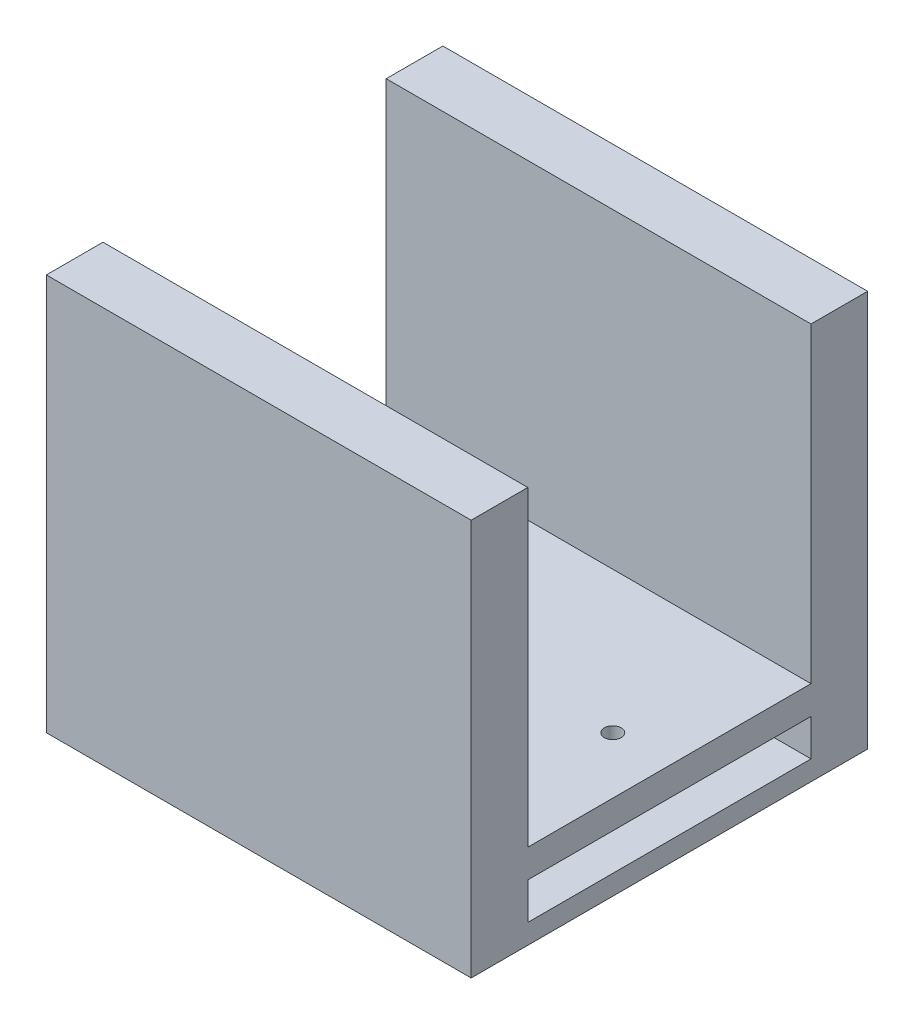
ISO-10303-21;
HEADER;
FILE_DESCRIPTION(('STEP AP214'),'2;1');
FILE_NAME('part.step','',(''),(''),'','','');
FILE_SCHEMA(('AUTOMOTIVE_DESIGN { 1 0 10303 214 1 1 1 1 }'));
ENDSEC;
DATA;
#1=APPLICATION_CONTEXT('core data for automotive mechanical design processes');
#2=APPLICATION_PROTOCOL_DEFINITION('international standard','automotive_design',2000,#1);
#3=PRODUCT_CONTEXT('',#1,'mechanical');
#4=PRODUCT('Part','Part','',(#3));
#5=PRODUCT_RELATED_PRODUCT_CATEGORY('part','',(#4));
#6=PRODUCT_DEFINITION_FORMATION('','',#4);
#7=PRODUCT_DEFINITION_CONTEXT('part definition',#1,'design');
#8=PRODUCT_DEFINITION('design','',#6,#7);
#9=PRODUCT_DEFINITION_SHAPE('','',#8);
#10=(LENGTH_UNIT() NAMED_UNIT(*) SI_UNIT(.MILLI.,.METRE.));
#11=(NAMED_UNIT(*) PLANE_ANGLE_UNIT() SI_UNIT($,.RADIAN.));
#12=(NAMED_UNIT(*) SI_UNIT($,.STERADIAN.) SOLID_ANGLE_UNIT());
#13=UNCERTAINTY_MEASURE_WITH_UNIT(LENGTH_MEASURE(1.E-05),#10,'distance_accuracy_value','');
#14=(GEOMETRIC_REPRESENTATION_CONTEXT(3) GLOBAL_UNCERTAINTY_ASSIGNED_CONTEXT((#13)) GLOBAL_UNIT_ASSIGNED_CONTEXT((#10,
#11,#12)) REPRESENTATION_CONTEXT('',''));
#15=CARTESIAN_POINT('',(0.,0.,0.));
#16=DIRECTION('',(0.,0.,1.));
#17=DIRECTION('',(1.,0.,0.));
#18=AXIS2_PLACEMENT_3D('',#15,#16,#17);
#19=CARTESIAN_POINT('',(0.,140.,0.));
#20=DIRECTION('',(0.,1.,0.));
#21=DIRECTION('',(0.,0.,1.));
#22=AXIS2_PLACEMENT_3D('',#19,#20,#21);
#23=PLANE('',#22);
#24=DIRECTION('',(-1.,0.,0.));
#25=VECTOR('',#24,1.);
#26=CARTESIAN_POINT('',(-59.1428571428571,140.,-15.7857142857143));
#27=LINE('',#26,#25);
#28=CARTESIAN_POINT('',(90.8571428571429,140.,-15.7857142857143));
#29=VERTEX_POINT('',#28);
#30=CARTESIAN_POINT('',(-59.1428571428571,140.,-15.7857142857143));
#31=VERTEX_POINT('',#30);
#32=EDGE_CURVE('E167',#29,#31,#27,.T.);
#33=ORIENTED_EDGE('',*,*,#32,.F.);
#34=DIRECTION('',(0.,0.,-1.));
#35=VECTOR('',#34,1.);
#36=CARTESIAN_POINT('',(90.8571428571429,140.,-35.7857142857143));
#37=LINE('',#36,#35);
#38=CARTESIAN_POINT('',(90.8571428571429,140.,-35.7857142857143));
#39=VERTEX_POINT('',#38);
#40=EDGE_CURVE('E194',#29,#39,#37,.T.);
#41=ORIENTED_EDGE('',*,*,#40,.T.);
#42=DIRECTION('',(-1.,0.,0.));
#43=VECTOR('',#42,1.);
#44=CARTESIAN_POINT('',(-59.1428571428571,140.,-35.7857142857143));
#45=LINE('',#44,#43);
#46=CARTESIAN_POINT('',(-59.1428571428571,140.,-35.7857142857143));
#47=VERTEX_POINT('',#46);
#48=EDGE_CURVE('E198',#39,#47,#45,.T.);
#49=ORIENTED_EDGE('',*,*,#48,.T.);
#50=DIRECTION('',(0.,0.,1.));
#51=VECTOR('',#50,1.);
#52=CARTESIAN_POINT('',(-59.1428571428571,140.,-35.7857142857143));
#53=LINE('',#52,#51);
#54=EDGE_CURVE('E188',#47,#31,#53,.T.);
#55=ORIENTED_EDGE('',*,*,#54,.T.);
#56=EDGE_LOOP('',(#33,#41,#49,#55));
#57=FACE_BOUND('',#56,.T.);
#58=ADVANCED_FACE('F33',(#57),#23,.T.);
#59=CARTESIAN_POINT('',(-59.1428571428571,140.,-35.7857142857143));
#60=DIRECTION('',(1.,0.,0.));
#61=DIRECTION('',(0.,0.,-1.));
#62=AXIS2_PLACEMENT_3D('',#59,#60,#61);
#63=PLANE('',#62);
#64=DIRECTION('',(0.,0.,1.));
#65=VECTOR('',#64,1.);
#66=CARTESIAN_POINT('',(-59.1428571428571,20.,84.2142857142858));
#67=LINE('',#66,#65);
#68=CARTESIAN_POINT('',(-59.1428571428572,20.,-15.7857142857143));
#69=VERTEX_POINT('',#68);
#70=CARTESIAN_POINT('',(-59.1428571428571,20.,84.2142857142858));
#71=VERTEX_POINT('',#70);
#72=EDGE_CURVE('E132',#69,#71,#67,.T.);
#73=ORIENTED_EDGE('',*,*,#72,.T.);
#74=DIRECTION('',(0.,-1.,0.));
#75=VECTOR('',#74,1.);
#76=CARTESIAN_POINT('',(-59.1428571428571,20.,84.2142857142858));
#77=LINE('',#76,#75);
#78=CARTESIAN_POINT('',(-59.1428571428571,7.,84.2142857142858));
#79=VERTEX_POINT('',#78);
#80=EDGE_CURVE('E126',#71,#79,#77,.T.);
#81=ORIENTED_EDGE('',*,*,#80,.T.);
#82=DIRECTION('',(0.,0.,-1.));
#83=VECTOR('',#82,1.);
#84=CARTESIAN_POINT('',(-59.1428571428571,7.,84.2142857142858));
#85=LINE('',#84,#83);
#86=CARTESIAN_POINT('',(-59.1428571428571,7.00000000000001,-15.7857142857143));
#87=VERTEX_POINT('',#86);
#88=EDGE_CURVE('E135',#79,#87,#85,.T.);
#89=ORIENTED_EDGE('',*,*,#88,.T.);
#90=DIRECTION('',(0.,1.,0.));
#91=VECTOR('',#90,1.);
#92=CARTESIAN_POINT('',(-59.1428571428572,20.,-15.7857142857143));
#93=LINE('',#92,#91);
#94=EDGE_CURVE('E50',#87,#69,#93,.T.);
#95=ORIENTED_EDGE('',*,*,#94,.T.);
#96=EDGE_LOOP('',(#73,#81,#89,#95));
#97=FACE_BOUND('',#96,.T.);
#98=DIRECTION('',(0.,0.,1.));
#99=VECTOR('',#98,1.);
#100=CARTESIAN_POINT('',(-59.1428571428571,30.,-15.7857142857143));
#101=LINE('',#100,#99);
#102=CARTESIAN_POINT('',(-59.1428571428571,30.,-15.7857142857143));
#103=VERTEX_POINT('',#102);
#104=CARTESIAN_POINT('',(-59.1428571428571,30.,84.2142857142857));
#105=VERTEX_POINT('',#104);
#106=EDGE_CURVE('E163',#103,#105,#101,.T.);
#107=ORIENTED_EDGE('',*,*,#106,.F.);
#108=DIRECTION('',(0.,1.,0.));
#109=VECTOR('',#108,1.);
#110=CARTESIAN_POINT('',(-59.1428571428571,30.,-15.7857142857143));
#111=LINE('',#110,#109);
#112=EDGE_CURVE('E178',#103,#31,#111,.T.);
#113=ORIENTED_EDGE('',*,*,#112,.T.);
#114=ORIENTED_EDGE('',*,*,#54,.F.);
#115=DIRECTION('',(0.,-1.,0.));
#116=VECTOR('',#115,1.);
#117=CARTESIAN_POINT('',(-59.1428571428571,140.,-35.7857142857143));
#118=LINE('',#117,#116);
#119=CARTESIAN_POINT('',(-59.1428571428571,0.,-35.7857142857143));
#120=VERTEX_POINT('',#119);
#121=EDGE_CURVE('E200',#47,#120,#118,.T.);
#122=ORIENTED_EDGE('',*,*,#121,.T.);
#123=DIRECTION('',(0.,0.,1.));
#124=VECTOR('',#123,1.);
#125=CARTESIAN_POINT('',(-59.1428571428571,0.,-35.7857142857143));
#126=LINE('',#125,#124);
#127=CARTESIAN_POINT('',(-59.1428571428571,0.,104.214285714286));
#128=VERTEX_POINT('',#127);
#129=EDGE_CURVE('E181',#120,#128,#126,.T.);
#130=ORIENTED_EDGE('',*,*,#129,.T.);
#131=DIRECTION('',(0.,-1.,0.));
#132=VECTOR('',#131,1.);
#133=CARTESIAN_POINT('',(-59.1428571428571,140.,104.214285714286));
#134=LINE('',#133,#132);
#135=CARTESIAN_POINT('',(-59.1428571428571,140.,104.214285714286));
#136=VERTEX_POINT('',#135);
#137=EDGE_CURVE('E11',#136,#128,#134,.T.);
#138=ORIENTED_EDGE('',*,*,#137,.F.);
#139=CARTESIAN_POINT('',(-59.1428571428571,140.,84.2142857142857));
#140=VERTEX_POINT('',#139);
#141=EDGE_CURVE('E192',#140,#136,#53,.T.);
#142=ORIENTED_EDGE('',*,*,#141,.F.);
#143=DIRECTION('',(0.,1.,0.));
#144=VECTOR('',#143,1.);
#145=CARTESIAN_POINT('',(-59.1428571428571,30.,84.2142857142857));
#146=LINE('',#145,#144);
#147=EDGE_CURVE('E175',#105,#140,#146,.T.);
#148=ORIENTED_EDGE('',*,*,#147,.F.);
#149=EDGE_LOOP('',(#107,#113,#114,#122,#130,#138,#142,#148));
#150=FACE_BOUND('',#149,.T.);
#151=ADVANCED_FACE('F35',(#97,#150),#63,.F.);
#152=CARTESIAN_POINT('',(-59.1428571428571,140.,104.214285714286));
#153=DIRECTION('',(0.,0.,-1.));
#154=DIRECTION('',(-1.,0.,0.));
#155=AXIS2_PLACEMENT_3D('',#152,#153,#154);
#156=PLANE('',#155);
#157=DIRECTION('',(1.,0.,0.));
#158=VECTOR('',#157,1.);
#159=CARTESIAN_POINT('',(-59.1428571428571,0.,104.214285714286));
#160=LINE('',#159,#158);
#161=CARTESIAN_POINT('',(90.8571428571429,0.,104.214285714286));
#162=VERTEX_POINT('',#161);
#163=EDGE_CURVE('E203',#128,#162,#160,.T.);
#164=ORIENTED_EDGE('',*,*,#163,.T.);
#165=DIRECTION('',(0.,-1.,0.));
#166=VECTOR('',#165,1.);
#167=CARTESIAN_POINT('',(90.8571428571429,140.,104.214285714286));
#168=LINE('',#167,#166);
#169=CARTESIAN_POINT('',(90.8571428571429,140.,104.214285714286));
#170=VERTEX_POINT('',#169);
#171=EDGE_CURVE('E42',#170,#162,#168,.T.);
#172=ORIENTED_EDGE('',*,*,#171,.F.);
#173=DIRECTION('',(1.,0.,0.));
#174=VECTOR('',#173,1.);
#175=CARTESIAN_POINT('',(-59.1428571428571,140.,104.214285714286));
#176=LINE('',#175,#174);
#177=EDGE_CURVE('E191',#136,#170,#176,.T.);
#178=ORIENTED_EDGE('',*,*,#177,.F.);
#179=ORIENTED_EDGE('',*,*,#137,.T.);
#180=EDGE_LOOP('',(#164,#172,#178,#179));
#181=FACE_BOUND('',#180,.T.);
#182=ADVANCED_FACE('F261',(#181),#156,.F.);
#183=CARTESIAN_POINT('',(90.8571428571429,140.,-35.7857142857143));
#184=DIRECTION('',(-1.,0.,0.));
#185=DIRECTION('',(0.,0.,1.));
#186=AXIS2_PLACEMENT_3D('',#183,#184,#185);
#187=PLANE('',#186);
#188=DIRECTION('',(0.,0.,-1.));
#189=VECTOR('',#188,1.);
#190=CARTESIAN_POINT('',(90.8571428571429,7.,84.2142857142857));
#191=LINE('',#190,#189);
#192=CARTESIAN_POINT('',(90.8571428571429,7.00000000000001,84.2142857142857));
#193=VERTEX_POINT('',#192);
#194=CARTESIAN_POINT('',(90.8571428571429,7.,-15.7857142857143));
#195=VERTEX_POINT('',#194);
#196=EDGE_CURVE('E153',#193,#195,#191,.T.);
#197=ORIENTED_EDGE('',*,*,#196,.F.);
#198=DIRECTION('',(0.,-1.,0.));
#199=VECTOR('',#198,1.);
#200=CARTESIAN_POINT('',(90.8571428571429,20.,84.2142857142857));
#201=LINE('',#200,#199);
#202=CARTESIAN_POINT('',(90.8571428571429,20.,84.2142857142857));
#203=VERTEX_POINT('',#202);
#204=EDGE_CURVE('E58',#203,#193,#201,.T.);
#205=ORIENTED_EDGE('',*,*,#204,.F.);
#206=DIRECTION('',(0.,0.,1.));
#207=VECTOR('',#206,1.);
#208=CARTESIAN_POINT('',(90.8571428571429,20.,84.2142857142857));
#209=LINE('',#208,#207);
#210=CARTESIAN_POINT('',(90.8571428571429,20.,-15.7857142857143));
#211=VERTEX_POINT('',#210);
#212=EDGE_CURVE('E141',#211,#203,#209,.T.);
#213=ORIENTED_EDGE('',*,*,#212,.F.);
#214=DIRECTION('',(0.,1.,0.));
#215=VECTOR('',#214,1.);
#216=CARTESIAN_POINT('',(90.8571428571429,20.,-15.7857142857143));
#217=LINE('',#216,#215);
#218=EDGE_CURVE('E144',#195,#211,#217,.T.);
#219=ORIENTED_EDGE('',*,*,#218,.F.);
#220=EDGE_LOOP('',(#197,#205,#213,#219));
#221=FACE_BOUND('',#220,.T.);
#222=ORIENTED_EDGE('',*,*,#40,.F.);
#223=DIRECTION('',(0.,1.,0.));
#224=VECTOR('',#223,1.);
#225=CARTESIAN_POINT('',(90.8571428571429,30.,-15.7857142857143));
#226=LINE('',#225,#224);
#227=CARTESIAN_POINT('',(90.8571428571429,30.,-15.7857142857143));
#228=VERTEX_POINT('',#227);
#229=EDGE_CURVE('E182',#228,#29,#226,.T.);
#230=ORIENTED_EDGE('',*,*,#229,.F.);
#231=DIRECTION('',(0.,0.,-1.));
#232=VECTOR('',#231,1.);
#233=CARTESIAN_POINT('',(90.8571428571429,30.,-15.7857142857143));
#234=LINE('',#233,#232);
#235=CARTESIAN_POINT('',(90.8571428571429,30.,84.2142857142857));
#236=VERTEX_POINT('',#235);
#237=EDGE_CURVE('E170',#236,#228,#234,.T.);
#238=ORIENTED_EDGE('',*,*,#237,.F.);
#239=DIRECTION('',(0.,1.,0.));
#240=VECTOR('',#239,1.);
#241=CARTESIAN_POINT('',(90.8571428571429,30.,84.2142857142857));
#242=LINE('',#241,#240);
#243=CARTESIAN_POINT('',(90.8571428571429,140.,84.2142857142857));
#244=VERTEX_POINT('',#243);
#245=EDGE_CURVE('E184',#236,#244,#242,.T.);
#246=ORIENTED_EDGE('',*,*,#245,.T.);
#247=EDGE_CURVE('E195',#170,#244,#37,.T.);
#248=ORIENTED_EDGE('',*,*,#247,.F.);
#249=ORIENTED_EDGE('',*,*,#171,.T.);
#250=DIRECTION('',(0.,0.,-1.));
#251=VECTOR('',#250,1.);
#252=CARTESIAN_POINT('',(90.8571428571429,0.,-35.7857142857143));
#253=LINE('',#252,#251);
#254=CARTESIAN_POINT('',(90.8571428571429,0.,-35.7857142857143));
#255=VERTEX_POINT('',#254);
#256=EDGE_CURVE('E205',#162,#255,#253,.T.);
#257=ORIENTED_EDGE('',*,*,#256,.T.);
#258=DIRECTION('',(0.,-1.,0.));
#259=VECTOR('',#258,1.);
#260=CARTESIAN_POINT('',(90.8571428571429,140.,-35.7857142857143));
#261=LINE('',#260,#259);
#262=EDGE_CURVE('E211',#39,#255,#261,.T.);
#263=ORIENTED_EDGE('',*,*,#262,.F.);
#264=EDGE_LOOP('',(#222,#230,#238,#246,#248,#249,#257,#263));
#265=FACE_BOUND('',#264,.T.);
#266=ADVANCED_FACE('F275',(#221,#265),#187,.F.);
#267=CARTESIAN_POINT('',(-59.1428571428571,140.,-35.7857142857143));
#268=DIRECTION('',(0.,0.,1.));
#269=DIRECTION('',(1.,0.,0.));
#270=AXIS2_PLACEMENT_3D('',#267,#268,#269);
#271=PLANE('',#270);
#272=DIRECTION('',(-1.,0.,0.));
#273=VECTOR('',#272,1.);
#274=CARTESIAN_POINT('',(-59.1428571428571,0.,-35.7857142857143));
#275=LINE('',#274,#273);
#276=EDGE_CURVE('E207',#255,#120,#275,.T.);
#277=ORIENTED_EDGE('',*,*,#276,.T.);
#278=ORIENTED_EDGE('',*,*,#121,.F.);
#279=ORIENTED_EDGE('',*,*,#48,.F.);
#280=ORIENTED_EDGE('',*,*,#262,.T.);
#281=EDGE_LOOP('',(#277,#278,#279,#280));
#282=FACE_BOUND('',#281,.T.);
#283=ADVANCED_FACE('F267',(#282),#271,.F.);
#284=DIRECTION('',(1.,0.,0.));
#285=VECTOR('',#284,1.);
#286=CARTESIAN_POINT('',(-59.1428571428571,140.,84.2142857142857));
#287=LINE('',#286,#285);
#288=EDGE_CURVE('E159',#140,#244,#287,.T.);
#289=ORIENTED_EDGE('',*,*,#288,.F.);
#290=ORIENTED_EDGE('',*,*,#141,.T.);
#291=ORIENTED_EDGE('',*,*,#177,.T.);
#292=ORIENTED_EDGE('',*,*,#247,.T.);
#293=EDGE_LOOP('',(#289,#290,#291,#292));
#294=FACE_BOUND('',#293,.T.);
#295=ADVANCED_FACE('F257',(#294),#23,.T.);
#296=CARTESIAN_POINT('',(0.,0.,0.));
#297=DIRECTION('',(0.,1.,0.));
#298=DIRECTION('',(0.,0.,1.));
#299=AXIS2_PLACEMENT_3D('',#296,#297,#298);
#300=PLANE('',#299);
#301=CARTESIAN_POINT('',(-29.1428571428571,0.,34.2142857142857));
#302=DIRECTION('',(0.,1.,0.));
#303=DIRECTION('',(0.,0.,1.));
#304=AXIS2_PLACEMENT_3D('',#301,#302,#303);
#305=CIRCLE('',#304,3.);
#306=CARTESIAN_POINT('',(-29.1428571428571,0.,37.2142857142857));
#307=VERTEX_POINT('',#306);
#308=EDGE_CURVE('E233',#307,#307,#305,.T.);
#309=ORIENTED_EDGE('',*,*,#308,.T.);
#310=EDGE_LOOP('',(#309));
#311=FACE_BOUND('',#310,.T.);
#312=CARTESIAN_POINT('',(70.8571428571429,0.,34.2142857142857));
#313=DIRECTION('',(0.,1.,0.));
#314=DIRECTION('',(0.,0.,1.));
#315=AXIS2_PLACEMENT_3D('',#312,#313,#314);
#316=CIRCLE('',#315,3.00000000000001);
#317=CARTESIAN_POINT('',(70.8571428571429,0.,37.2142857142857));
#318=VERTEX_POINT('',#317);
#319=EDGE_CURVE('E147',#318,#318,#316,.T.);
#320=ORIENTED_EDGE('',*,*,#319,.T.);
#321=EDGE_LOOP('',(#320));
#322=FACE_BOUND('',#321,.T.);
#323=ORIENTED_EDGE('',*,*,#129,.F.);
#324=ORIENTED_EDGE('',*,*,#276,.F.);
#325=ORIENTED_EDGE('',*,*,#256,.F.);
#326=ORIENTED_EDGE('',*,*,#163,.F.);
#327=EDGE_LOOP('',(#323,#324,#325,#326));
#328=FACE_BOUND('',#327,.T.);
#329=ADVANCED_FACE('F266',(#311,#322,#328),#300,.F.);
#330=CARTESIAN_POINT('',(-59.1428571428571,30.,-15.7857142857143));
#331=DIRECTION('',(0.,0.,-1.));
#332=DIRECTION('',(-1.,0.,0.));
#333=AXIS2_PLACEMENT_3D('',#330,#331,#332);
#334=PLANE('',#333);
#335=ORIENTED_EDGE('',*,*,#32,.T.);
#336=ORIENTED_EDGE('',*,*,#112,.F.);
#337=DIRECTION('',(-1.,0.,0.));
#338=VECTOR('',#337,1.);
#339=CARTESIAN_POINT('',(-59.1428571428571,30.,-15.7857142857143));
#340=LINE('',#339,#338);
#341=EDGE_CURVE('E172',#228,#103,#340,.T.);
#342=ORIENTED_EDGE('',*,*,#341,.F.);
#343=ORIENTED_EDGE('',*,*,#229,.T.);
#344=EDGE_LOOP('',(#335,#336,#342,#343));
#345=FACE_BOUND('',#344,.T.);
#346=ADVANCED_FACE('F274',(#345),#334,.F.);
#347=CARTESIAN_POINT('',(-59.1428571428571,30.,84.2142857142857));
#348=DIRECTION('',(0.,0.,1.));
#349=DIRECTION('',(1.,0.,0.));
#350=AXIS2_PLACEMENT_3D('',#347,#348,#349);
#351=PLANE('',#350);
#352=ORIENTED_EDGE('',*,*,#288,.T.);
#353=ORIENTED_EDGE('',*,*,#245,.F.);
#354=DIRECTION('',(1.,0.,0.));
#355=VECTOR('',#354,1.);
#356=CARTESIAN_POINT('',(-59.1428571428571,30.,84.2142857142857));
#357=LINE('',#356,#355);
#358=EDGE_CURVE('E166',#105,#236,#357,.T.);
#359=ORIENTED_EDGE('',*,*,#358,.F.);
#360=ORIENTED_EDGE('',*,*,#147,.T.);
#361=EDGE_LOOP('',(#352,#353,#359,#360));
#362=FACE_BOUND('',#361,.T.);
#363=ADVANCED_FACE('F294',(#362),#351,.F.);
#364=CARTESIAN_POINT('',(0.,30.,0.));
#365=DIRECTION('',(0.,1.,0.));
#366=DIRECTION('',(0.,0.,1.));
#367=AXIS2_PLACEMENT_3D('',#364,#365,#366);
#368=PLANE('',#367);
#369=CARTESIAN_POINT('',(-29.1428571428571,30.,34.2142857142857));
#370=DIRECTION('',(0.,1.,0.));
#371=DIRECTION('',(0.,0.,1.));
#372=AXIS2_PLACEMENT_3D('',#369,#370,#371);
#373=CIRCLE('',#372,3.);
#374=CARTESIAN_POINT('',(-29.1428571428571,30.,37.2142857142857));
#375=VERTEX_POINT('',#374);
#376=EDGE_CURVE('E230',#375,#375,#373,.T.);
#377=ORIENTED_EDGE('',*,*,#376,.F.);
#378=EDGE_LOOP('',(#377));
#379=FACE_BOUND('',#378,.T.);
#380=CARTESIAN_POINT('',(70.8571428571429,30.,34.2142857142857));
#381=DIRECTION('',(0.,1.,0.));
#382=DIRECTION('',(0.,0.,1.));
#383=AXIS2_PLACEMENT_3D('',#380,#381,#382);
#384=CIRCLE('',#383,3.00000000000001);
#385=CARTESIAN_POINT('',(70.8571428571429,30.,37.2142857142857));
#386=VERTEX_POINT('',#385);
#387=EDGE_CURVE('E218',#386,#386,#384,.T.);
#388=ORIENTED_EDGE('',*,*,#387,.F.);
#389=EDGE_LOOP('',(#388));
#390=FACE_BOUND('',#389,.T.);
#391=ORIENTED_EDGE('',*,*,#106,.T.);
#392=ORIENTED_EDGE('',*,*,#358,.T.);
#393=ORIENTED_EDGE('',*,*,#237,.T.);
#394=ORIENTED_EDGE('',*,*,#341,.T.);
#395=EDGE_LOOP('',(#391,#392,#393,#394));
#396=FACE_BOUND('',#395,.T.);
#397=ADVANCED_FACE('F296',(#379,#390,#396),#368,.T.);
#398=CARTESIAN_POINT('',(-59.1428571428571,20.,84.2142857142858));
#399=DIRECTION('',(0.,0.,1.));
#400=DIRECTION('',(1.,0.,0.));
#401=AXIS2_PLACEMENT_3D('',#398,#399,#400);
#402=PLANE('',#401);
#403=ORIENTED_EDGE('',*,*,#204,.T.);
#404=DIRECTION('',(1.,0.,0.));
#405=VECTOR('',#404,1.);
#406=CARTESIAN_POINT('',(-59.1428571428571,7.,84.2142857142858));
#407=LINE('',#406,#405);
#408=EDGE_CURVE('E122',#79,#193,#407,.T.);
#409=ORIENTED_EDGE('',*,*,#408,.F.);
#410=ORIENTED_EDGE('',*,*,#80,.F.);
#411=DIRECTION('',(1.,0.,0.));
#412=VECTOR('',#411,1.);
#413=CARTESIAN_POINT('',(-59.1428571428571,20.,84.2142857142858));
#414=LINE('',#413,#412);
#415=EDGE_CURVE('E157',#71,#203,#414,.T.);
#416=ORIENTED_EDGE('',*,*,#415,.T.);
#417=EDGE_LOOP('',(#403,#409,#410,#416));
#418=FACE_BOUND('',#417,.T.);
#419=ADVANCED_FACE('F124',(#418),#402,.F.);
#420=CARTESIAN_POINT('',(-59.1428571428571,20.,84.2142857142858));
#421=DIRECTION('',(0.,1.,0.));
#422=DIRECTION('',(0.,0.,1.));
#423=AXIS2_PLACEMENT_3D('',#420,#421,#422);
#424=PLANE('',#423);
#425=CARTESIAN_POINT('',(-29.1428571428571,20.,34.2142857142857));
#426=DIRECTION('',(0.,1.,0.));
#427=DIRECTION('',(0.,0.,1.));
#428=AXIS2_PLACEMENT_3D('',#425,#426,#427);
#429=CIRCLE('',#428,3.);
#430=CARTESIAN_POINT('',(-29.1428571428571,20.,37.2142857142857));
#431=VERTEX_POINT('',#430);
#432=EDGE_CURVE('E223',#431,#431,#429,.T.);
#433=ORIENTED_EDGE('',*,*,#432,.T.);
#434=EDGE_LOOP('',(#433));
#435=FACE_BOUND('',#434,.T.);
#436=CARTESIAN_POINT('',(70.8571428571429,20.,34.2142857142857));
#437=DIRECTION('',(0.,1.,0.));
#438=DIRECTION('',(0.,0.,1.));
#439=AXIS2_PLACEMENT_3D('',#436,#437,#438);
#440=CIRCLE('',#439,3.00000000000001);
#441=CARTESIAN_POINT('',(70.8571428571429,20.,37.2142857142857));
#442=VERTEX_POINT('',#441);
#443=EDGE_CURVE('E217',#442,#442,#440,.T.);
#444=ORIENTED_EDGE('',*,*,#443,.T.);
#445=EDGE_LOOP('',(#444));
#446=FACE_BOUND('',#445,.T.);
#447=ORIENTED_EDGE('',*,*,#212,.T.);
#448=ORIENTED_EDGE('',*,*,#415,.F.);
#449=ORIENTED_EDGE('',*,*,#72,.F.);
#450=DIRECTION('',(1.,0.,0.));
#451=VECTOR('',#450,1.);
#452=CARTESIAN_POINT('',(-59.1428571428572,20.,-15.7857142857143));
#453=LINE('',#452,#451);
#454=EDGE_CURVE('E160',#69,#211,#453,.T.);
#455=ORIENTED_EDGE('',*,*,#454,.T.);
#456=EDGE_LOOP('',(#447,#448,#449,#455));
#457=FACE_BOUND('',#456,.T.);
#458=ADVANCED_FACE('F316',(#435,#446,#457),#424,.F.);
#459=CARTESIAN_POINT('',(-59.1428571428572,20.,-15.7857142857143));
#460=DIRECTION('',(0.,0.,-1.));
#461=DIRECTION('',(-1.,0.,0.));
#462=AXIS2_PLACEMENT_3D('',#459,#460,#461);
#463=PLANE('',#462);
#464=ORIENTED_EDGE('',*,*,#218,.T.);
#465=ORIENTED_EDGE('',*,*,#454,.F.);
#466=ORIENTED_EDGE('',*,*,#94,.F.);
#467=DIRECTION('',(1.,0.,0.));
#468=VECTOR('',#467,1.);
#469=CARTESIAN_POINT('',(-59.1428571428572,7.,-15.7857142857143));
#470=LINE('',#469,#468);
#471=EDGE_CURVE('E131',#87,#195,#470,.T.);
#472=ORIENTED_EDGE('',*,*,#471,.T.);
#473=EDGE_LOOP('',(#464,#465,#466,#472));
#474=FACE_BOUND('',#473,.T.);
#475=ADVANCED_FACE('F319',(#474),#463,.F.);
#476=CARTESIAN_POINT('',(-59.1428571428571,7.,84.2142857142858));
#477=DIRECTION('',(0.,-1.,0.));
#478=DIRECTION('',(0.,0.,-1.));
#479=AXIS2_PLACEMENT_3D('',#476,#477,#478);
#480=PLANE('',#479);
#481=CARTESIAN_POINT('',(-29.1428571428571,7.,34.2142857142857));
#482=DIRECTION('',(0.,-1.,0.));
#483=DIRECTION('',(0.,0.,-1.));
#484=AXIS2_PLACEMENT_3D('',#481,#482,#483);
#485=CIRCLE('',#484,3.);
#486=CARTESIAN_POINT('',(-29.1428571428571,7.,31.2142857142857));
#487=VERTEX_POINT('',#486);
#488=EDGE_CURVE('E37',#487,#487,#485,.T.);
#489=ORIENTED_EDGE('',*,*,#488,.T.);
#490=EDGE_LOOP('',(#489));
#491=FACE_BOUND('',#490,.T.);
#492=CARTESIAN_POINT('',(70.8571428571429,7.,34.2142857142857));
#493=DIRECTION('',(0.,-1.,0.));
#494=DIRECTION('',(0.,0.,-1.));
#495=AXIS2_PLACEMENT_3D('',#492,#493,#494);
#496=CIRCLE('',#495,3.00000000000001);
#497=CARTESIAN_POINT('',(70.8571428571429,7.,31.2142857142857));
#498=VERTEX_POINT('',#497);
#499=EDGE_CURVE('E215',#498,#498,#496,.T.);
#500=ORIENTED_EDGE('',*,*,#499,.T.);
#501=EDGE_LOOP('',(#500));
#502=FACE_BOUND('',#501,.T.);
#503=ORIENTED_EDGE('',*,*,#196,.T.);
#504=ORIENTED_EDGE('',*,*,#471,.F.);
#505=ORIENTED_EDGE('',*,*,#88,.F.);
#506=ORIENTED_EDGE('',*,*,#408,.T.);
#507=EDGE_LOOP('',(#503,#504,#505,#506));
#508=FACE_BOUND('',#507,.T.);
#509=ADVANCED_FACE('F136',(#491,#502,#508),#480,.F.);
#510=CARTESIAN_POINT('',(70.8571428571429,-20.,34.2142857142857));
#511=DIRECTION('',(0.,1.,0.));
#512=DIRECTION('',(0.,0.,1.));
#513=AXIS2_PLACEMENT_3D('',#510,#511,#512);
#514=CYLINDRICAL_SURFACE('',#513,3.00000000000001);
#515=ORIENTED_EDGE('',*,*,#499,.F.);
#516=EDGE_LOOP('',(#515));
#517=FACE_BOUND('',#516,.T.);
#518=ORIENTED_EDGE('',*,*,#319,.F.);
#519=EDGE_LOOP('',(#518));
#520=FACE_BOUND('',#519,.T.);
#521=ADVANCED_FACE('F252',(#517,#520),#514,.F.);
#522=ORIENTED_EDGE('',*,*,#387,.T.);
#523=EDGE_LOOP('',(#522));
#524=FACE_BOUND('',#523,.T.);
#525=ORIENTED_EDGE('',*,*,#443,.F.);
#526=EDGE_LOOP('',(#525));
#527=FACE_BOUND('',#526,.T.);
#528=ADVANCED_FACE('F244',(#524,#527),#514,.F.);
#529=CARTESIAN_POINT('',(-29.1428571428571,0.,34.2142857142857));
#530=DIRECTION('',(0.,1.,0.));
#531=DIRECTION('',(0.,0.,1.));
#532=AXIS2_PLACEMENT_3D('',#529,#530,#531);
#533=CYLINDRICAL_SURFACE('',#532,3.);
#534=ORIENTED_EDGE('',*,*,#308,.F.);
#535=EDGE_LOOP('',(#534));
#536=FACE_BOUND('',#535,.T.);
#537=ORIENTED_EDGE('',*,*,#488,.F.);
#538=EDGE_LOOP('',(#537));
#539=FACE_BOUND('',#538,.T.);
#540=ADVANCED_FACE('F241',(#536,#539),#533,.F.);
#541=ORIENTED_EDGE('',*,*,#376,.T.);
#542=EDGE_LOOP('',(#541));
#543=FACE_BOUND('',#542,.T.);
#544=ORIENTED_EDGE('',*,*,#432,.F.);
#545=EDGE_LOOP('',(#544));
#546=FACE_BOUND('',#545,.T.);
#547=ADVANCED_FACE('F243',(#543,#546),#533,.F.);
#548=CLOSED_SHELL('',(#58,#151,#182,#266,#283,#295,#329,#346,#363,#397,#419,#458,#475,#509,#521,
#528,#540,#547));
#549=MANIFOLD_SOLID_BREP('B2',#548);
#550=ADVANCED_BREP_SHAPE_REPRESENTATION('',(#18,#549),#14);
#551=SHAPE_DEFINITION_REPRESENTATION(#9,#550);
ENDSEC;
END-ISO-10303-21;
